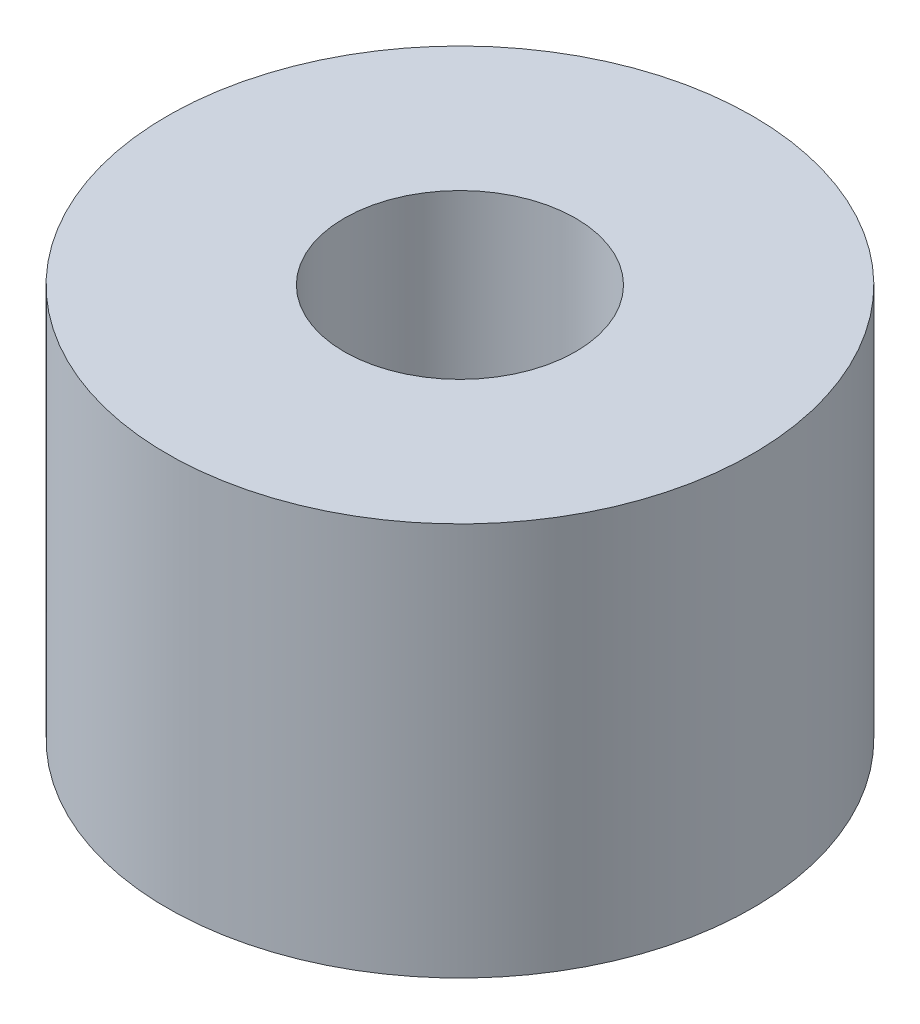
ISO-10303-21;
HEADER;
FILE_DESCRIPTION(('STEP AP214'),'2;1');
FILE_NAME('part.step','',(''),(''),'','','');
FILE_SCHEMA(('AUTOMOTIVE_DESIGN { 1 0 10303 214 1 1 1 1 }'));
ENDSEC;
DATA;
#1=APPLICATION_CONTEXT('core data for automotive mechanical design processes');
#2=APPLICATION_PROTOCOL_DEFINITION('international standard','automotive_design',2000,#1);
#3=PRODUCT_CONTEXT('',#1,'mechanical');
#4=PRODUCT('Part','Part','',(#3));
#5=PRODUCT_RELATED_PRODUCT_CATEGORY('part','',(#4));
#6=PRODUCT_DEFINITION_FORMATION('','',#4);
#7=PRODUCT_DEFINITION_CONTEXT('part definition',#1,'design');
#8=PRODUCT_DEFINITION('design','',#6,#7);
#9=PRODUCT_DEFINITION_SHAPE('','',#8);
#10=(LENGTH_UNIT() NAMED_UNIT(*) SI_UNIT(.MILLI.,.METRE.));
#11=(NAMED_UNIT(*) PLANE_ANGLE_UNIT() SI_UNIT($,.RADIAN.));
#12=(NAMED_UNIT(*) SI_UNIT($,.STERADIAN.) SOLID_ANGLE_UNIT());
#13=UNCERTAINTY_MEASURE_WITH_UNIT(LENGTH_MEASURE(1.E-05),#10,'distance_accuracy_value','');
#14=(GEOMETRIC_REPRESENTATION_CONTEXT(3) GLOBAL_UNCERTAINTY_ASSIGNED_CONTEXT((#13)) GLOBAL_UNIT_ASSIGNED_CONTEXT((#10,
#11,#12)) REPRESENTATION_CONTEXT('',''));
#15=CARTESIAN_POINT('',(0.,0.,0.));
#16=DIRECTION('',(0.,0.,1.));
#17=DIRECTION('',(1.,0.,0.));
#18=AXIS2_PLACEMENT_3D('',#15,#16,#17);
#19=CARTESIAN_POINT('',(0.,0.,0.));
#20=DIRECTION('',(0.,-1.,0.));
#21=DIRECTION('',(0.,0.,-1.));
#22=AXIS2_PLACEMENT_3D('',#19,#20,#21);
#23=CYLINDRICAL_SURFACE('',#22,3.795);
#24=CARTESIAN_POINT('',(0.,5.1,0.));
#25=DIRECTION('',(0.,-1.,0.));
#26=DIRECTION('',(0.,0.,-1.));
#27=AXIS2_PLACEMENT_3D('',#24,#25,#26);
#28=CIRCLE('',#27,3.795);
#29=CARTESIAN_POINT('',(0.,5.1,-3.795));
#30=VERTEX_POINT('',#29);
#31=EDGE_CURVE('E46',#30,#30,#28,.T.);
#32=ORIENTED_EDGE('',*,*,#31,.T.);
#33=EDGE_LOOP('',(#32));
#34=FACE_BOUND('',#33,.T.);
#35=CARTESIAN_POINT('',(0.,0.,0.));
#36=DIRECTION('',(0.,-1.,0.));
#37=DIRECTION('',(0.,0.,-1.));
#38=AXIS2_PLACEMENT_3D('',#35,#36,#37);
#39=CIRCLE('',#38,3.795);
#40=CARTESIAN_POINT('',(0.,0.,-3.795));
#41=VERTEX_POINT('',#40);
#42=EDGE_CURVE('E10',#41,#41,#39,.T.);
#43=ORIENTED_EDGE('',*,*,#42,.F.);
#44=EDGE_LOOP('',(#43));
#45=FACE_BOUND('',#44,.T.);
#46=ADVANCED_FACE('F32',(#34,#45),#23,.T.);
#47=CARTESIAN_POINT('',(3.795,0.,0.));
#48=DIRECTION('',(0.,-1.,0.));
#49=DIRECTION('',(0.,0.,-1.));
#50=AXIS2_PLACEMENT_3D('',#47,#48,#49);
#51=PLANE('',#50);
#52=ORIENTED_EDGE('',*,*,#42,.T.);
#53=EDGE_LOOP('',(#52));
#54=FACE_BOUND('',#53,.T.);
#55=CARTESIAN_POINT('',(0.,0.,0.));
#56=DIRECTION('',(0.,-1.,0.));
#57=DIRECTION('',(0.,0.,-1.));
#58=AXIS2_PLACEMENT_3D('',#55,#56,#57);
#59=CIRCLE('',#58,1.5);
#60=CARTESIAN_POINT('',(0.,0.,-1.5));
#61=VERTEX_POINT('',#60);
#62=EDGE_CURVE('E38',#61,#61,#59,.T.);
#63=ORIENTED_EDGE('',*,*,#62,.F.);
#64=EDGE_LOOP('',(#63));
#65=FACE_BOUND('',#64,.T.);
#66=ADVANCED_FACE('F62',(#54,#65),#51,.T.);
#67=CARTESIAN_POINT('',(0.,0.,0.));
#68=DIRECTION('',(0.,-1.,0.));
#69=DIRECTION('',(0.,0.,-1.));
#70=AXIS2_PLACEMENT_3D('',#67,#68,#69);
#71=CYLINDRICAL_SURFACE('',#70,1.5);
#72=ORIENTED_EDGE('',*,*,#62,.T.);
#73=EDGE_LOOP('',(#72));
#74=FACE_BOUND('',#73,.T.);
#75=CARTESIAN_POINT('',(0.,5.1,0.));
#76=DIRECTION('',(0.,-1.,0.));
#77=DIRECTION('',(0.,0.,-1.));
#78=AXIS2_PLACEMENT_3D('',#75,#76,#77);
#79=CIRCLE('',#78,1.5);
#80=CARTESIAN_POINT('',(0.,5.1,-1.5));
#81=VERTEX_POINT('',#80);
#82=EDGE_CURVE('E42',#81,#81,#79,.T.);
#83=ORIENTED_EDGE('',*,*,#82,.F.);
#84=EDGE_LOOP('',(#83));
#85=FACE_BOUND('',#84,.T.);
#86=ADVANCED_FACE('F56',(#74,#85),#71,.F.);
#87=CARTESIAN_POINT('',(1.5,5.1,0.));
#88=DIRECTION('',(0.,1.,0.));
#89=DIRECTION('',(0.,0.,1.));
#90=AXIS2_PLACEMENT_3D('',#87,#88,#89);
#91=PLANE('',#90);
#92=ORIENTED_EDGE('',*,*,#82,.T.);
#93=EDGE_LOOP('',(#92));
#94=FACE_BOUND('',#93,.T.);
#95=ORIENTED_EDGE('',*,*,#31,.F.);
#96=EDGE_LOOP('',(#95));
#97=FACE_BOUND('',#96,.T.);
#98=ADVANCED_FACE('F54',(#94,#97),#91,.T.);
#99=CLOSED_SHELL('',(#46,#66,#86,#98));
#100=MANIFOLD_SOLID_BREP('B2',#99);
#101=ADVANCED_BREP_SHAPE_REPRESENTATION('',(#18,#100),#14);
#102=SHAPE_DEFINITION_REPRESENTATION(#9,#101);
ENDSEC;
END-ISO-10303-21;
